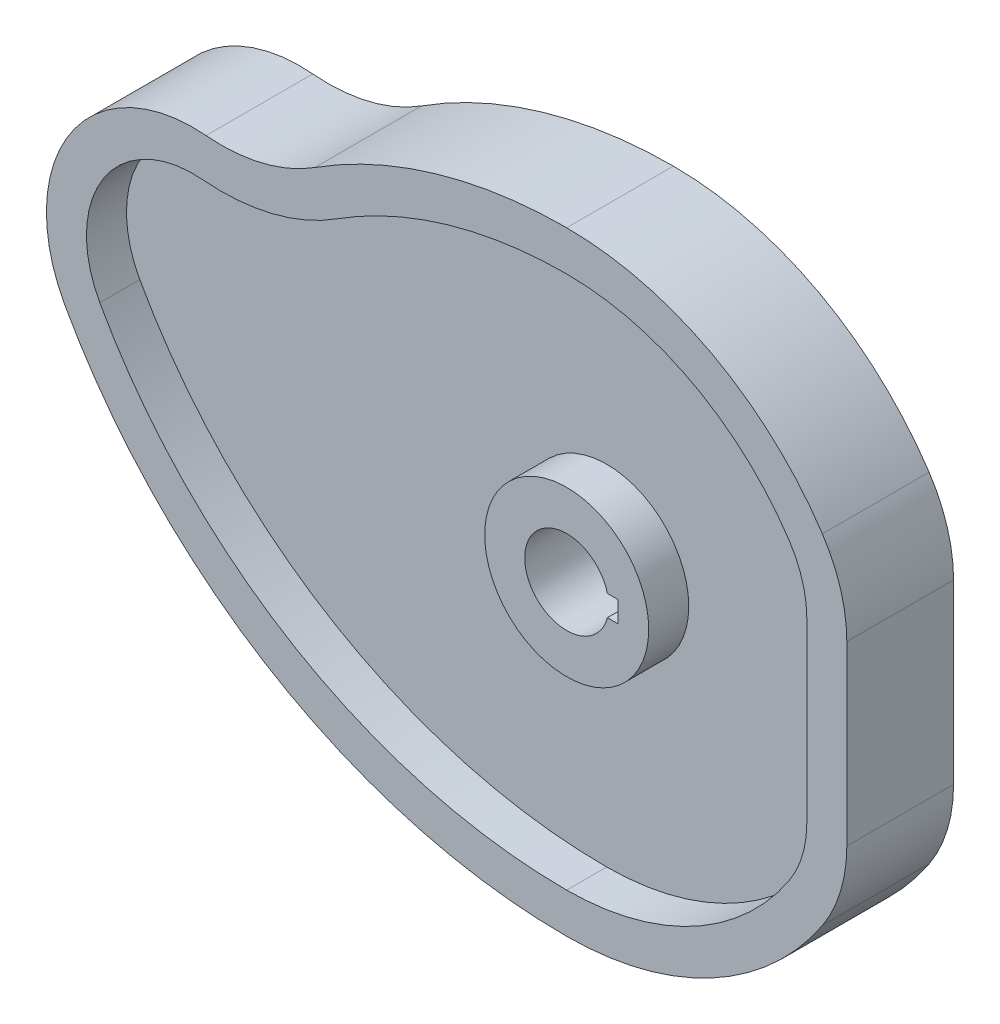
ISO-10303-21;
HEADER;
FILE_DESCRIPTION(('STEP AP214'),'2;1');
FILE_NAME('part.step','',(''),(''),'','','');
FILE_SCHEMA(('AUTOMOTIVE_DESIGN { 1 0 10303 214 1 1 1 1 }'));
ENDSEC;
DATA;
#1=APPLICATION_CONTEXT('core data for automotive mechanical design processes');
#2=APPLICATION_PROTOCOL_DEFINITION('international standard','automotive_design',2000,#1);
#3=PRODUCT_CONTEXT('',#1,'mechanical');
#4=PRODUCT('Part','Part','',(#3));
#5=PRODUCT_RELATED_PRODUCT_CATEGORY('part','',(#4));
#6=PRODUCT_DEFINITION_FORMATION('','',#4);
#7=PRODUCT_DEFINITION_CONTEXT('part definition',#1,'design');
#8=PRODUCT_DEFINITION('design','',#6,#7);
#9=PRODUCT_DEFINITION_SHAPE('','',#8);
#10=(LENGTH_UNIT() NAMED_UNIT(*) SI_UNIT(.MILLI.,.METRE.));
#11=(NAMED_UNIT(*) PLANE_ANGLE_UNIT() SI_UNIT($,.RADIAN.));
#12=(NAMED_UNIT(*) SI_UNIT($,.STERADIAN.) SOLID_ANGLE_UNIT());
#13=UNCERTAINTY_MEASURE_WITH_UNIT(LENGTH_MEASURE(1.E-05),#10,'distance_accuracy_value','');
#14=(GEOMETRIC_REPRESENTATION_CONTEXT(3) GLOBAL_UNCERTAINTY_ASSIGNED_CONTEXT((#13)) GLOBAL_UNIT_ASSIGNED_CONTEXT((#10,
#11,#12)) REPRESENTATION_CONTEXT('',''));
#15=CARTESIAN_POINT('',(0.,0.,0.));
#16=DIRECTION('',(0.,0.,1.));
#17=DIRECTION('',(1.,0.,0.));
#18=AXIS2_PLACEMENT_3D('',#15,#16,#17);
#19=CARTESIAN_POINT('',(0.,0.,25.4));
#20=DIRECTION('',(0.,0.,-1.));
#21=DIRECTION('',(-1.,0.,0.));
#22=AXIS2_PLACEMENT_3D('',#19,#20,#21);
#23=CYLINDRICAL_SURFACE('',#22,127.);
#24=DIRECTION('',(0.,0.,-1.));
#25=VECTOR('',#24,1.);
#26=CARTESIAN_POINT('',(0.,-127.,25.4));
#27=LINE('',#26,#25);
#28=CARTESIAN_POINT('',(0.,-127.,-6.35));
#29=VERTEX_POINT('',#28);
#30=CARTESIAN_POINT('',(0.,-127.,-25.4));
#31=VERTEX_POINT('',#30);
#32=EDGE_CURVE('E517',#29,#31,#27,.T.);
#33=ORIENTED_EDGE('',*,*,#32,.F.);
#34=CARTESIAN_POINT('',(0.,0.,-6.35));
#35=DIRECTION('',(0.,0.,1.));
#36=DIRECTION('',(1.,0.,0.));
#37=AXIS2_PLACEMENT_3D('',#34,#35,#36);
#38=CIRCLE('',#37,127.);
#39=CARTESIAN_POINT('',(105.832287787377,-70.2034675902108,-6.35));
#40=VERTEX_POINT('',#39);
#41=EDGE_CURVE('E354',#29,#40,#38,.T.);
#42=ORIENTED_EDGE('',*,*,#41,.T.);
#43=DIRECTION('',(0.,0.,-1.));
#44=VECTOR('',#43,1.);
#45=CARTESIAN_POINT('',(105.832287787377,-70.2034675902108,25.4));
#46=LINE('',#45,#44);
#47=CARTESIAN_POINT('',(105.832287787377,-70.2034675902108,-25.4));
#48=VERTEX_POINT('',#47);
#49=EDGE_CURVE('E420',#40,#48,#46,.T.);
#50=ORIENTED_EDGE('',*,*,#49,.T.);
#51=CARTESIAN_POINT('',(0.,0.,-25.4));
#52=DIRECTION('',(0.,0.,1.));
#53=DIRECTION('',(1.,0.,0.));
#54=AXIS2_PLACEMENT_3D('',#51,#52,#53);
#55=CIRCLE('',#54,127.);
#56=EDGE_CURVE('E352',#31,#48,#55,.T.);
#57=ORIENTED_EDGE('',*,*,#56,.F.);
#58=EDGE_LOOP('',(#33,#42,#50,#57));
#59=FACE_BOUND('',#58,.T.);
#60=ADVANCED_FACE('F70',(#59),#23,.F.);
#61=CARTESIAN_POINT('',(0.,126.996455690165,25.4));
#62=DIRECTION('',(0.,0.,-1.));
#63=DIRECTION('',(-1.,0.,0.));
#64=AXIS2_PLACEMENT_3D('',#61,#62,#63);
#65=CYLINDRICAL_SURFACE('',#64,253.996455690165);
#66=CARTESIAN_POINT('',(0.,126.996455690165,-6.35));
#67=DIRECTION('',(0.,0.,1.));
#68=DIRECTION('',(1.,0.,0.));
#69=AXIS2_PLACEMENT_3D('',#66,#67,#68);
#70=CIRCLE('',#69,253.996455690165);
#71=CARTESIAN_POINT('',(-222.2507753313,4.03795713149713,-6.35));
#72=VERTEX_POINT('',#71);
#73=EDGE_CURVE('E87',#29,#72,#70,.F.);
#74=ORIENTED_EDGE('',*,*,#73,.F.);
#75=ORIENTED_EDGE('',*,*,#32,.T.);
#76=CARTESIAN_POINT('',(0.,126.996455690165,-25.4));
#77=DIRECTION('',(0.,0.,1.));
#78=DIRECTION('',(1.,0.,0.));
#79=AXIS2_PLACEMENT_3D('',#76,#77,#78);
#80=CIRCLE('',#79,253.996455690165);
#81=CARTESIAN_POINT('',(-222.2507753313,4.03795713149713,-25.4));
#82=VERTEX_POINT('',#81);
#83=EDGE_CURVE('E423',#31,#82,#80,.F.);
#84=ORIENTED_EDGE('',*,*,#83,.T.);
#85=DIRECTION('',(0.,0.,-1.));
#86=VECTOR('',#85,1.);
#87=CARTESIAN_POINT('',(-222.2507753313,4.03795713149713,25.4));
#88=LINE('',#87,#86);
#89=EDGE_CURVE('E514',#72,#82,#88,.T.);
#90=ORIENTED_EDGE('',*,*,#89,.F.);
#91=EDGE_LOOP('',(#74,#75,#84,#90));
#92=FACE_BOUND('',#91,.T.);
#93=ADVANCED_FACE('F524',(#92),#65,.F.);
#94=CARTESIAN_POINT('',(-177.8,28.63,25.4));
#95=DIRECTION('',(0.,0.,-1.));
#96=DIRECTION('',(-1.,0.,0.));
#97=AXIS2_PLACEMENT_3D('',#94,#95,#96);
#98=CYLINDRICAL_SURFACE('',#97,50.8);
#99=DIRECTION('',(0.,0.,-1.));
#100=VECTOR('',#99,1.);
#101=CARTESIAN_POINT('',(-173.343775758532,79.2341704359409,25.4));
#102=LINE('',#101,#100);
#103=CARTESIAN_POINT('',(-173.343775758532,79.2341704359409,-6.35));
#104=VERTEX_POINT('',#103);
#105=CARTESIAN_POINT('',(-173.343775758532,79.2341704359409,-25.4));
#106=VERTEX_POINT('',#105);
#107=EDGE_CURVE('E511',#104,#106,#102,.T.);
#108=ORIENTED_EDGE('',*,*,#107,.F.);
#109=CARTESIAN_POINT('',(-177.8,28.63,-6.35));
#110=DIRECTION('',(0.,0.,1.));
#111=DIRECTION('',(1.,0.,0.));
#112=AXIS2_PLACEMENT_3D('',#109,#110,#111);
#113=CIRCLE('',#112,50.8);
#114=EDGE_CURVE('E95',#104,#72,#113,.T.);
#115=ORIENTED_EDGE('',*,*,#114,.T.);
#116=ORIENTED_EDGE('',*,*,#89,.T.);
#117=CARTESIAN_POINT('',(-177.8,28.63,-25.4));
#118=DIRECTION('',(0.,0.,1.));
#119=DIRECTION('',(1.,0.,0.));
#120=AXIS2_PLACEMENT_3D('',#117,#118,#119);
#121=CIRCLE('',#120,50.8);
#122=EDGE_CURVE('E426',#106,#82,#121,.T.);
#123=ORIENTED_EDGE('',*,*,#122,.F.);
#124=EDGE_LOOP('',(#108,#115,#116,#123));
#125=FACE_BOUND('',#124,.T.);
#126=ADVANCED_FACE('F522',(#125),#98,.F.);
#127=CARTESIAN_POINT('',(-164.431327275596,180.442511307823,25.4));
#128=DIRECTION('',(0.,0.,-1.));
#129=DIRECTION('',(-1.,0.,0.));
#130=AXIS2_PLACEMENT_3D('',#127,#128,#129);
#131=CYLINDRICAL_SURFACE('',#130,101.6);
#132=CARTESIAN_POINT('',(-164.431327275596,180.442511307823,-6.35));
#133=DIRECTION('',(0.,0.,1.));
#134=DIRECTION('',(1.,0.,0.));
#135=AXIS2_PLACEMENT_3D('',#132,#133,#134);
#136=CIRCLE('',#135,101.6);
#137=CARTESIAN_POINT('',(-109.620884850397,94.8950075385484,-6.35));
#138=VERTEX_POINT('',#137);
#139=EDGE_CURVE('E369',#104,#138,#136,.T.);
#140=ORIENTED_EDGE('',*,*,#139,.F.);
#141=ORIENTED_EDGE('',*,*,#107,.T.);
#142=CARTESIAN_POINT('',(-164.431327275596,180.442511307823,-25.4));
#143=DIRECTION('',(0.,0.,1.));
#144=DIRECTION('',(1.,0.,0.));
#145=AXIS2_PLACEMENT_3D('',#142,#143,#144);
#146=CIRCLE('',#145,101.6);
#147=CARTESIAN_POINT('',(-109.620884850397,94.8950075385484,-25.4));
#148=VERTEX_POINT('',#147);
#149=EDGE_CURVE('E429',#106,#148,#146,.T.);
#150=ORIENTED_EDGE('',*,*,#149,.T.);
#151=DIRECTION('',(0.,0.,-1.));
#152=VECTOR('',#151,1.);
#153=CARTESIAN_POINT('',(-109.620884850397,94.8950075385484,25.4));
#154=LINE('',#153,#152);
#155=EDGE_CURVE('E507',#138,#148,#154,.T.);
#156=ORIENTED_EDGE('',*,*,#155,.F.);
#157=EDGE_LOOP('',(#140,#141,#150,#156));
#158=FACE_BOUND('',#157,.T.);
#159=ADVANCED_FACE('F533',(#158),#131,.T.);
#160=CARTESIAN_POINT('',(0.,-76.2,25.4));
#161=DIRECTION('',(0.,0.,-1.));
#162=DIRECTION('',(-1.,0.,0.));
#163=AXIS2_PLACEMENT_3D('',#160,#161,#162);
#164=CYLINDRICAL_SURFACE('',#163,203.2);
#165=DIRECTION('',(0.,0.,-1.));
#166=VECTOR('',#165,1.);
#167=CARTESIAN_POINT('',(0.,127.,25.4));
#168=LINE('',#167,#166);
#169=CARTESIAN_POINT('',(0.,127.,-6.35));
#170=VERTEX_POINT('',#169);
#171=CARTESIAN_POINT('',(0.,127.,-25.4));
#172=VERTEX_POINT('',#171);
#173=EDGE_CURVE('E503',#170,#172,#168,.T.);
#174=ORIENTED_EDGE('',*,*,#173,.F.);
#175=CARTESIAN_POINT('',(0.,-76.2,-6.35));
#176=DIRECTION('',(0.,0.,1.));
#177=DIRECTION('',(1.,0.,0.));
#178=AXIS2_PLACEMENT_3D('',#175,#176,#177);
#179=CIRCLE('',#178,203.2);
#180=EDGE_CURVE('E367',#170,#138,#179,.T.);
#181=ORIENTED_EDGE('',*,*,#180,.T.);
#182=ORIENTED_EDGE('',*,*,#155,.T.);
#183=CARTESIAN_POINT('',(0.,-76.2,-25.4));
#184=DIRECTION('',(0.,0.,1.));
#185=DIRECTION('',(1.,0.,0.));
#186=AXIS2_PLACEMENT_3D('',#183,#184,#185);
#187=CIRCLE('',#186,203.2);
#188=EDGE_CURVE('E432',#172,#148,#187,.T.);
#189=ORIENTED_EDGE('',*,*,#188,.F.);
#190=EDGE_LOOP('',(#174,#181,#182,#189));
#191=FACE_BOUND('',#190,.T.);
#192=ADVANCED_FACE('F559',(#191),#164,.F.);
#193=CARTESIAN_POINT('',(0.,0.,25.4));
#194=DIRECTION('',(0.,0.,-1.));
#195=DIRECTION('',(-1.,0.,0.));
#196=AXIS2_PLACEMENT_3D('',#193,#194,#195);
#197=CYLINDRICAL_SURFACE('',#196,127.);
#198=DIRECTION('',(0.,0.,-1.));
#199=VECTOR('',#198,1.);
#200=CARTESIAN_POINT('',(105.832287787377,70.2034675902108,25.4));
#201=LINE('',#200,#199);
#202=CARTESIAN_POINT('',(105.832287787377,70.2034675902108,-6.35));
#203=VERTEX_POINT('',#202);
#204=CARTESIAN_POINT('',(105.832287787377,70.2034675902108,-25.4));
#205=VERTEX_POINT('',#204);
#206=EDGE_CURVE('E499',#203,#205,#201,.T.);
#207=ORIENTED_EDGE('',*,*,#206,.F.);
#208=CARTESIAN_POINT('',(0.,0.,-6.35));
#209=DIRECTION('',(0.,0.,1.));
#210=DIRECTION('',(1.,0.,0.));
#211=AXIS2_PLACEMENT_3D('',#208,#209,#210);
#212=CIRCLE('',#211,127.);
#213=EDGE_CURVE('E365',#203,#170,#212,.T.);
#214=ORIENTED_EDGE('',*,*,#213,.T.);
#215=ORIENTED_EDGE('',*,*,#173,.T.);
#216=CARTESIAN_POINT('',(0.,0.,-25.4));
#217=DIRECTION('',(0.,0.,1.));
#218=DIRECTION('',(1.,0.,0.));
#219=AXIS2_PLACEMENT_3D('',#216,#217,#218);
#220=CIRCLE('',#219,127.);
#221=EDGE_CURVE('E435',#205,#172,#220,.T.);
#222=ORIENTED_EDGE('',*,*,#221,.F.);
#223=EDGE_LOOP('',(#207,#214,#215,#222));
#224=FACE_BOUND('',#223,.T.);
#225=ADVANCED_FACE('F556',(#224),#197,.F.);
#226=CARTESIAN_POINT('',(63.4962362204731,42.1200000000002,25.4));
#227=DIRECTION('',(0.,0.,-1.));
#228=DIRECTION('',(-1.,0.,0.));
#229=AXIS2_PLACEMENT_3D('',#226,#227,#228);
#230=CYLINDRICAL_SURFACE('',#229,50.8037637795269);
#231=DIRECTION('',(0.,0.,-1.));
#232=VECTOR('',#231,1.);
#233=CARTESIAN_POINT('',(114.3,42.12,25.4));
#234=LINE('',#233,#232);
#235=CARTESIAN_POINT('',(114.3,42.12,-6.35));
#236=VERTEX_POINT('',#235);
#237=CARTESIAN_POINT('',(114.3,42.12,-25.4));
#238=VERTEX_POINT('',#237);
#239=EDGE_CURVE('E495',#236,#238,#234,.T.);
#240=ORIENTED_EDGE('',*,*,#239,.F.);
#241=CARTESIAN_POINT('',(63.4962362204731,42.1200000000002,-6.35));
#242=DIRECTION('',(0.,0.,1.));
#243=DIRECTION('',(1.,0.,0.));
#244=AXIS2_PLACEMENT_3D('',#241,#242,#243);
#245=CIRCLE('',#244,50.8037637795269);
#246=EDGE_CURVE('E363',#236,#203,#245,.T.);
#247=ORIENTED_EDGE('',*,*,#246,.T.);
#248=ORIENTED_EDGE('',*,*,#206,.T.);
#249=CARTESIAN_POINT('',(63.4962362204731,42.1200000000002,-25.4));
#250=DIRECTION('',(0.,0.,1.));
#251=DIRECTION('',(1.,0.,0.));
#252=AXIS2_PLACEMENT_3D('',#249,#250,#251);
#253=CIRCLE('',#252,50.8037637795269);
#254=EDGE_CURVE('E438',#238,#205,#253,.T.);
#255=ORIENTED_EDGE('',*,*,#254,.F.);
#256=EDGE_LOOP('',(#240,#247,#248,#255));
#257=FACE_BOUND('',#256,.T.);
#258=ADVANCED_FACE('F551',(#257),#230,.F.);
#259=CARTESIAN_POINT('',(114.3,0.,25.4));
#260=DIRECTION('',(1.,0.,0.));
#261=DIRECTION('',(0.,0.,-1.));
#262=AXIS2_PLACEMENT_3D('',#259,#260,#261);
#263=PLANE('',#262);
#264=DIRECTION('',(0.,-1.,0.));
#265=VECTOR('',#264,1.);
#266=CARTESIAN_POINT('',(114.3,0.,-6.35));
#267=LINE('',#266,#265);
#268=CARTESIAN_POINT('',(114.3,-42.12,-6.35));
#269=VERTEX_POINT('',#268);
#270=EDGE_CURVE('E360',#236,#269,#267,.T.);
#271=ORIENTED_EDGE('',*,*,#270,.F.);
#272=ORIENTED_EDGE('',*,*,#239,.T.);
#273=DIRECTION('',(0.,-1.,0.));
#274=VECTOR('',#273,1.);
#275=CARTESIAN_POINT('',(114.3,0.,-25.4));
#276=LINE('',#275,#274);
#277=CARTESIAN_POINT('',(114.3,-42.12,-25.4));
#278=VERTEX_POINT('',#277);
#279=EDGE_CURVE('E441',#238,#278,#276,.T.);
#280=ORIENTED_EDGE('',*,*,#279,.T.);
#281=DIRECTION('',(0.,0.,-1.));
#282=VECTOR('',#281,1.);
#283=CARTESIAN_POINT('',(114.3,-42.12,25.4));
#284=LINE('',#283,#282);
#285=EDGE_CURVE('E491',#269,#278,#284,.T.);
#286=ORIENTED_EDGE('',*,*,#285,.F.);
#287=EDGE_LOOP('',(#271,#272,#280,#286));
#288=FACE_BOUND('',#287,.T.);
#289=ADVANCED_FACE('F547',(#288),#263,.F.);
#290=CARTESIAN_POINT('',(63.4962362204729,-42.1200000000002,25.4));
#291=DIRECTION('',(0.,0.,-1.));
#292=DIRECTION('',(-1.,0.,0.));
#293=AXIS2_PLACEMENT_3D('',#290,#291,#292);
#294=CYLINDRICAL_SURFACE('',#293,50.8037637795269);
#295=CARTESIAN_POINT('',(63.4962362204729,-42.1200000000002,-6.35));
#296=DIRECTION('',(0.,0.,1.));
#297=DIRECTION('',(1.,0.,0.));
#298=AXIS2_PLACEMENT_3D('',#295,#296,#297);
#299=CIRCLE('',#298,50.8037637795269);
#300=EDGE_CURVE('E357',#269,#40,#299,.F.);
#301=ORIENTED_EDGE('',*,*,#300,.F.);
#302=ORIENTED_EDGE('',*,*,#285,.T.);
#303=CARTESIAN_POINT('',(63.4962362204729,-42.1200000000002,-25.4));
#304=DIRECTION('',(0.,0.,1.));
#305=DIRECTION('',(1.,0.,0.));
#306=AXIS2_PLACEMENT_3D('',#303,#304,#305);
#307=CIRCLE('',#306,50.8037637795269);
#308=EDGE_CURVE('E444',#278,#48,#307,.F.);
#309=ORIENTED_EDGE('',*,*,#308,.T.);
#310=ORIENTED_EDGE('',*,*,#49,.F.);
#311=EDGE_LOOP('',(#301,#302,#309,#310));
#312=FACE_BOUND('',#311,.T.);
#313=ADVANCED_FACE('F544',(#312),#294,.F.);
#314=CARTESIAN_POINT('',(63.4962362204731,42.1200000000002,25.4));
#315=DIRECTION('',(0.,0.,-1.));
#316=DIRECTION('',(-1.,0.,0.));
#317=AXIS2_PLACEMENT_3D('',#314,#315,#316);
#318=CYLINDRICAL_SURFACE('',#317,69.8537637795269);
#319=CARTESIAN_POINT('',(63.4962362204731,42.1200000000002,-25.4));
#320=DIRECTION('',(0.,0.,1.));
#321=DIRECTION('',(1.,0.,0.));
#322=AXIS2_PLACEMENT_3D('',#319,#320,#321);
#323=CIRCLE('',#322,69.8537637795269);
#324=CARTESIAN_POINT('',(133.35,42.12,-25.4));
#325=VERTEX_POINT('',#324);
#326=CARTESIAN_POINT('',(121.707130955484,80.7339877287424,-25.4));
#327=VERTEX_POINT('',#326);
#328=EDGE_CURVE('E447',#325,#327,#323,.T.);
#329=ORIENTED_EDGE('',*,*,#328,.T.);
#330=DIRECTION('',(0.,0.,-1.));
#331=VECTOR('',#330,1.);
#332=CARTESIAN_POINT('',(121.707130955484,80.7339877287424,25.4));
#333=LINE('',#332,#331);
#334=CARTESIAN_POINT('',(121.707130955484,80.7339877287424,25.4));
#335=VERTEX_POINT('',#334);
#336=EDGE_CURVE('E12',#335,#327,#333,.T.);
#337=ORIENTED_EDGE('',*,*,#336,.F.);
#338=CARTESIAN_POINT('',(63.4962362204731,42.1200000000002,25.4));
#339=DIRECTION('',(0.,0.,1.));
#340=DIRECTION('',(1.,0.,0.));
#341=AXIS2_PLACEMENT_3D('',#338,#339,#340);
#342=CIRCLE('',#341,69.8537637795269);
#343=CARTESIAN_POINT('',(133.35,42.12,25.4));
#344=VERTEX_POINT('',#343);
#345=EDGE_CURVE('E397',#344,#335,#342,.T.);
#346=ORIENTED_EDGE('',*,*,#345,.F.);
#347=DIRECTION('',(0.,0.,-1.));
#348=VECTOR('',#347,1.);
#349=CARTESIAN_POINT('',(133.35,42.12,25.4));
#350=LINE('',#349,#348);
#351=EDGE_CURVE('E472',#344,#325,#350,.T.);
#352=ORIENTED_EDGE('',*,*,#351,.T.);
#353=EDGE_LOOP('',(#329,#337,#346,#352));
#354=FACE_BOUND('',#353,.T.);
#355=ADVANCED_FACE('F669',(#354),#318,.T.);
#356=CARTESIAN_POINT('',(0.,0.,25.4));
#357=DIRECTION('',(0.,0.,-1.));
#358=DIRECTION('',(-1.,0.,0.));
#359=AXIS2_PLACEMENT_3D('',#356,#357,#358);
#360=CYLINDRICAL_SURFACE('',#359,146.05);
#361=CARTESIAN_POINT('',(0.,0.,-25.4));
#362=DIRECTION('',(0.,0.,1.));
#363=DIRECTION('',(1.,0.,0.));
#364=AXIS2_PLACEMENT_3D('',#361,#362,#363);
#365=CIRCLE('',#364,146.05);
#366=CARTESIAN_POINT('',(0.,146.05,-25.4));
#367=VERTEX_POINT('',#366);
#368=EDGE_CURVE('E450',#327,#367,#365,.T.);
#369=ORIENTED_EDGE('',*,*,#368,.T.);
#370=DIRECTION('',(0.,0.,-1.));
#371=VECTOR('',#370,1.);
#372=CARTESIAN_POINT('',(0.,146.05,25.4));
#373=LINE('',#372,#371);
#374=CARTESIAN_POINT('',(0.,146.05,25.4));
#375=VERTEX_POINT('',#374);
#376=EDGE_CURVE('E79',#375,#367,#373,.T.);
#377=ORIENTED_EDGE('',*,*,#376,.F.);
#378=CARTESIAN_POINT('',(0.,0.,25.4));
#379=DIRECTION('',(0.,0.,1.));
#380=DIRECTION('',(1.,0.,0.));
#381=AXIS2_PLACEMENT_3D('',#378,#379,#380);
#382=CIRCLE('',#381,146.05);
#383=EDGE_CURVE('E400',#335,#375,#382,.T.);
#384=ORIENTED_EDGE('',*,*,#383,.F.);
#385=ORIENTED_EDGE('',*,*,#336,.T.);
#386=EDGE_LOOP('',(#369,#377,#384,#385));
#387=FACE_BOUND('',#386,.T.);
#388=ADVANCED_FACE('F878',(#387),#360,.T.);
#389=CARTESIAN_POINT('',(0.,-76.2,25.4));
#390=DIRECTION('',(0.,0.,-1.));
#391=DIRECTION('',(-1.,0.,0.));
#392=AXIS2_PLACEMENT_3D('',#389,#390,#391);
#393=CYLINDRICAL_SURFACE('',#392,222.25);
#394=CARTESIAN_POINT('',(0.,-76.2,-25.4));
#395=DIRECTION('',(0.,0.,1.));
#396=DIRECTION('',(1.,0.,0.));
#397=AXIS2_PLACEMENT_3D('',#394,#395,#396);
#398=CIRCLE('',#397,222.25);
#399=CARTESIAN_POINT('',(-119.897842805122,110.935164495287,-25.4));
#400=VERTEX_POINT('',#399);
#401=EDGE_CURVE('E452',#367,#400,#398,.T.);
#402=ORIENTED_EDGE('',*,*,#401,.T.);
#403=DIRECTION('',(0.,0.,-1.));
#404=VECTOR('',#403,1.);
#405=CARTESIAN_POINT('',(-119.897842805122,110.935164495287,25.4));
#406=LINE('',#405,#404);
#407=CARTESIAN_POINT('',(-119.897842805122,110.935164495287,25.4));
#408=VERTEX_POINT('',#407);
#409=EDGE_CURVE('E484',#408,#400,#406,.T.);
#410=ORIENTED_EDGE('',*,*,#409,.F.);
#411=CARTESIAN_POINT('',(0.,-76.2,25.4));
#412=DIRECTION('',(0.,0.,1.));
#413=DIRECTION('',(1.,0.,0.));
#414=AXIS2_PLACEMENT_3D('',#411,#412,#413);
#415=CIRCLE('',#414,222.25);
#416=EDGE_CURVE('E402',#375,#408,#415,.T.);
#417=ORIENTED_EDGE('',*,*,#416,.F.);
#418=ORIENTED_EDGE('',*,*,#376,.T.);
#419=EDGE_LOOP('',(#402,#410,#417,#418));
#420=FACE_BOUND('',#419,.T.);
#421=ADVANCED_FACE('F874',(#420),#393,.T.);
#422=CARTESIAN_POINT('',(-164.431327275596,180.442511307823,25.4));
#423=DIRECTION('',(0.,0.,-1.));
#424=DIRECTION('',(-1.,0.,0.));
#425=AXIS2_PLACEMENT_3D('',#422,#423,#424);
#426=CYLINDRICAL_SURFACE('',#425,82.5499999999999);
#427=CARTESIAN_POINT('',(-164.431327275596,180.442511307823,-25.4));
#428=DIRECTION('',(0.,0.,1.));
#429=DIRECTION('',(1.,0.,0.));
#430=AXIS2_PLACEMENT_3D('',#427,#428,#429);
#431=CIRCLE('',#430,82.5499999999999);
#432=CARTESIAN_POINT('',(-171.672691667981,98.2107343494187,-25.4));
#433=VERTEX_POINT('',#432);
#434=EDGE_CURVE('E455',#433,#400,#431,.T.);
#435=ORIENTED_EDGE('',*,*,#434,.F.);
#436=DIRECTION('',(0.,0.,-1.));
#437=VECTOR('',#436,1.);
#438=CARTESIAN_POINT('',(-171.672691667981,98.2107343494187,25.4));
#439=LINE('',#438,#437);
#440=CARTESIAN_POINT('',(-171.672691667981,98.2107343494187,25.4));
#441=VERTEX_POINT('',#440);
#442=EDGE_CURVE('E482',#441,#433,#439,.T.);
#443=ORIENTED_EDGE('',*,*,#442,.F.);
#444=CARTESIAN_POINT('',(-164.431327275596,180.442511307823,25.4));
#445=DIRECTION('',(0.,0.,1.));
#446=DIRECTION('',(1.,0.,0.));
#447=AXIS2_PLACEMENT_3D('',#444,#445,#446);
#448=CIRCLE('',#447,82.5499999999999);
#449=EDGE_CURVE('E404',#441,#408,#448,.T.);
#450=ORIENTED_EDGE('',*,*,#449,.T.);
#451=ORIENTED_EDGE('',*,*,#409,.T.);
#452=EDGE_LOOP('',(#435,#443,#450,#451));
#453=FACE_BOUND('',#452,.T.);
#454=ADVANCED_FACE('F870',(#453),#426,.F.);
#455=CARTESIAN_POINT('',(-177.8,28.63,25.4));
#456=DIRECTION('',(0.,0.,-1.));
#457=DIRECTION('',(-1.,0.,0.));
#458=AXIS2_PLACEMENT_3D('',#455,#456,#457);
#459=CYLINDRICAL_SURFACE('',#458,69.85);
#460=CARTESIAN_POINT('',(-177.8,28.63,-25.4));
#461=DIRECTION('',(0.,0.,1.));
#462=DIRECTION('',(1.,0.,0.));
#463=AXIS2_PLACEMENT_3D('',#460,#461,#462);
#464=CIRCLE('',#463,69.85);
#465=CARTESIAN_POINT('',(-238.919816080538,-5.1840589441914,-25.4));
#466=VERTEX_POINT('',#465);
#467=EDGE_CURVE('E458',#433,#466,#464,.T.);
#468=ORIENTED_EDGE('',*,*,#467,.T.);
#469=DIRECTION('',(0.,0.,-1.));
#470=VECTOR('',#469,1.);
#471=CARTESIAN_POINT('',(-238.919816080538,-5.1840589441914,25.4));
#472=LINE('',#471,#470);
#473=CARTESIAN_POINT('',(-238.919816080538,-5.1840589441914,25.4));
#474=VERTEX_POINT('',#473);
#475=EDGE_CURVE('E480',#474,#466,#472,.T.);
#476=ORIENTED_EDGE('',*,*,#475,.F.);
#477=CARTESIAN_POINT('',(-177.8,28.63,25.4));
#478=DIRECTION('',(0.,0.,1.));
#479=DIRECTION('',(1.,0.,0.));
#480=AXIS2_PLACEMENT_3D('',#477,#478,#479);
#481=CIRCLE('',#480,69.85);
#482=EDGE_CURVE('E407',#441,#474,#481,.T.);
#483=ORIENTED_EDGE('',*,*,#482,.F.);
#484=ORIENTED_EDGE('',*,*,#442,.T.);
#485=EDGE_LOOP('',(#468,#476,#483,#484));
#486=FACE_BOUND('',#485,.T.);
#487=ADVANCED_FACE('F866',(#486),#459,.T.);
#488=CARTESIAN_POINT('',(0.,126.996455690165,25.4));
#489=DIRECTION('',(0.,0.,-1.));
#490=DIRECTION('',(-1.,0.,0.));
#491=AXIS2_PLACEMENT_3D('',#488,#489,#490);
#492=CYLINDRICAL_SURFACE('',#491,273.046455690165);
#493=CARTESIAN_POINT('',(0.,126.996455690165,-25.4));
#494=DIRECTION('',(0.,0.,1.));
#495=DIRECTION('',(1.,0.,0.));
#496=AXIS2_PLACEMENT_3D('',#493,#494,#495);
#497=CIRCLE('',#496,273.046455690165);
#498=CARTESIAN_POINT('',(0.,-146.05,-25.4));
#499=VERTEX_POINT('',#498);
#500=EDGE_CURVE('E461',#499,#466,#497,.F.);
#501=ORIENTED_EDGE('',*,*,#500,.F.);
#502=DIRECTION('',(0.,0.,-1.));
#503=VECTOR('',#502,1.);
#504=CARTESIAN_POINT('',(0.,-146.05,25.4));
#505=LINE('',#504,#503);
#506=CARTESIAN_POINT('',(0.,-146.05,25.4));
#507=VERTEX_POINT('',#506);
#508=EDGE_CURVE('E478',#507,#499,#505,.T.);
#509=ORIENTED_EDGE('',*,*,#508,.F.);
#510=CARTESIAN_POINT('',(0.,126.996455690165,25.4));
#511=DIRECTION('',(0.,0.,1.));
#512=DIRECTION('',(1.,0.,0.));
#513=AXIS2_PLACEMENT_3D('',#510,#511,#512);
#514=CIRCLE('',#513,273.046455690165);
#515=EDGE_CURVE('E409',#507,#474,#514,.F.);
#516=ORIENTED_EDGE('',*,*,#515,.T.);
#517=ORIENTED_EDGE('',*,*,#475,.T.);
#518=EDGE_LOOP('',(#501,#509,#516,#517));
#519=FACE_BOUND('',#518,.T.);
#520=ADVANCED_FACE('F862',(#519),#492,.T.);
#521=CARTESIAN_POINT('',(0.,0.,25.4));
#522=DIRECTION('',(0.,0.,-1.));
#523=DIRECTION('',(-1.,0.,0.));
#524=AXIS2_PLACEMENT_3D('',#521,#522,#523);
#525=CYLINDRICAL_SURFACE('',#524,146.05);
#526=CARTESIAN_POINT('',(0.,0.,-25.4));
#527=DIRECTION('',(0.,0.,1.));
#528=DIRECTION('',(1.,0.,0.));
#529=AXIS2_PLACEMENT_3D('',#526,#527,#528);
#530=CIRCLE('',#529,146.05);
#531=CARTESIAN_POINT('',(121.707130955484,-80.7339877287425,-25.4));
#532=VERTEX_POINT('',#531);
#533=EDGE_CURVE('E464',#499,#532,#530,.T.);
#534=ORIENTED_EDGE('',*,*,#533,.T.);
#535=DIRECTION('',(0.,0.,-1.));
#536=VECTOR('',#535,1.);
#537=CARTESIAN_POINT('',(121.707130955484,-80.7339877287425,25.4));
#538=LINE('',#537,#536);
#539=CARTESIAN_POINT('',(121.707130955484,-80.7339877287425,25.4));
#540=VERTEX_POINT('',#539);
#541=EDGE_CURVE('E476',#540,#532,#538,.T.);
#542=ORIENTED_EDGE('',*,*,#541,.F.);
#543=CARTESIAN_POINT('',(0.,0.,25.4));
#544=DIRECTION('',(0.,0.,1.));
#545=DIRECTION('',(1.,0.,0.));
#546=AXIS2_PLACEMENT_3D('',#543,#544,#545);
#547=CIRCLE('',#546,146.05);
#548=EDGE_CURVE('E412',#507,#540,#547,.T.);
#549=ORIENTED_EDGE('',*,*,#548,.F.);
#550=ORIENTED_EDGE('',*,*,#508,.T.);
#551=EDGE_LOOP('',(#534,#542,#549,#550));
#552=FACE_BOUND('',#551,.T.);
#553=ADVANCED_FACE('F587',(#552),#525,.T.);
#554=CARTESIAN_POINT('',(63.4962362204729,-42.1200000000002,25.4));
#555=DIRECTION('',(0.,0.,-1.));
#556=DIRECTION('',(-1.,0.,0.));
#557=AXIS2_PLACEMENT_3D('',#554,#555,#556);
#558=CYLINDRICAL_SURFACE('',#557,69.8537637795269);
#559=CARTESIAN_POINT('',(63.4962362204729,-42.1200000000002,-25.4));
#560=DIRECTION('',(0.,0.,1.));
#561=DIRECTION('',(1.,0.,0.));
#562=AXIS2_PLACEMENT_3D('',#559,#560,#561);
#563=CIRCLE('',#562,69.8537637795269);
#564=CARTESIAN_POINT('',(133.35,-42.1199999999999,-25.4));
#565=VERTEX_POINT('',#564);
#566=EDGE_CURVE('E467',#565,#532,#563,.F.);
#567=ORIENTED_EDGE('',*,*,#566,.F.);
#568=DIRECTION('',(0.,0.,-1.));
#569=VECTOR('',#568,1.);
#570=CARTESIAN_POINT('',(133.35,-42.1199999999999,25.4));
#571=LINE('',#570,#569);
#572=CARTESIAN_POINT('',(133.35,-42.1199999999999,25.4));
#573=VERTEX_POINT('',#572);
#574=EDGE_CURVE('E474',#573,#565,#571,.T.);
#575=ORIENTED_EDGE('',*,*,#574,.F.);
#576=CARTESIAN_POINT('',(63.4962362204729,-42.1200000000002,25.4));
#577=DIRECTION('',(0.,0.,1.));
#578=DIRECTION('',(1.,0.,0.));
#579=AXIS2_PLACEMENT_3D('',#576,#577,#578);
#580=CIRCLE('',#579,69.8537637795269);
#581=EDGE_CURVE('E414',#573,#540,#580,.F.);
#582=ORIENTED_EDGE('',*,*,#581,.T.);
#583=ORIENTED_EDGE('',*,*,#541,.T.);
#584=EDGE_LOOP('',(#567,#575,#582,#583));
#585=FACE_BOUND('',#584,.T.);
#586=ADVANCED_FACE('F579',(#585),#558,.T.);
#587=CARTESIAN_POINT('',(0.,0.,6.35));
#588=DIRECTION('',(0.,0.,1.));
#589=DIRECTION('',(1.,0.,0.));
#590=AXIS2_PLACEMENT_3D('',#587,#588,#589);
#591=CIRCLE('',#590,127.);
#592=CARTESIAN_POINT('',(0.,-127.,6.35));
#593=VERTEX_POINT('',#592);
#594=CARTESIAN_POINT('',(105.832287787377,-70.2034675902108,6.35));
#595=VERTEX_POINT('',#594);
#596=EDGE_CURVE('E330',#593,#595,#591,.T.);
#597=ORIENTED_EDGE('',*,*,#596,.F.);
#598=CARTESIAN_POINT('',(0.,-127.,25.4));
#599=VERTEX_POINT('',#598);
#600=EDGE_CURVE('E74',#599,#593,#27,.T.);
#601=ORIENTED_EDGE('',*,*,#600,.F.);
#602=CARTESIAN_POINT('',(0.,0.,25.4));
#603=DIRECTION('',(0.,0.,1.));
#604=DIRECTION('',(1.,0.,0.));
#605=AXIS2_PLACEMENT_3D('',#602,#603,#604);
#606=CIRCLE('',#605,127.);
#607=CARTESIAN_POINT('',(105.832287787377,-70.2034675902108,25.4));
#608=VERTEX_POINT('',#607);
#609=EDGE_CURVE('E373',#599,#608,#606,.T.);
#610=ORIENTED_EDGE('',*,*,#609,.T.);
#611=EDGE_CURVE('E488',#608,#595,#46,.T.);
#612=ORIENTED_EDGE('',*,*,#611,.T.);
#613=EDGE_LOOP('',(#597,#601,#610,#612));
#614=FACE_BOUND('',#613,.T.);
#615=ADVANCED_FACE('F72',(#614),#23,.F.);
#616=ORIENTED_EDGE('',*,*,#600,.T.);
#617=CARTESIAN_POINT('',(0.,126.996455690165,6.35));
#618=DIRECTION('',(0.,0.,1.));
#619=DIRECTION('',(1.,0.,0.));
#620=AXIS2_PLACEMENT_3D('',#617,#618,#619);
#621=CIRCLE('',#620,253.996455690165);
#622=CARTESIAN_POINT('',(-222.2507753313,4.03795713149713,6.35));
#623=VERTEX_POINT('',#622);
#624=EDGE_CURVE('E327',#593,#623,#621,.F.);
#625=ORIENTED_EDGE('',*,*,#624,.T.);
#626=CARTESIAN_POINT('',(-222.2507753313,4.03795713149713,25.4));
#627=VERTEX_POINT('',#626);
#628=EDGE_CURVE('E515',#627,#623,#88,.T.);
#629=ORIENTED_EDGE('',*,*,#628,.F.);
#630=CARTESIAN_POINT('',(0.,126.996455690165,25.4));
#631=DIRECTION('',(0.,0.,1.));
#632=DIRECTION('',(1.,0.,0.));
#633=AXIS2_PLACEMENT_3D('',#630,#631,#632);
#634=CIRCLE('',#633,253.996455690165);
#635=EDGE_CURVE('E376',#599,#627,#634,.F.);
#636=ORIENTED_EDGE('',*,*,#635,.F.);
#637=EDGE_LOOP('',(#616,#625,#629,#636));
#638=FACE_BOUND('',#637,.T.);
#639=ADVANCED_FACE('F577',(#638),#65,.F.);
#640=CARTESIAN_POINT('',(-177.8,28.63,6.35));
#641=DIRECTION('',(0.,0.,1.));
#642=DIRECTION('',(1.,0.,0.));
#643=AXIS2_PLACEMENT_3D('',#640,#641,#642);
#644=CIRCLE('',#643,50.8);
#645=CARTESIAN_POINT('',(-173.343775758532,79.2341704359409,6.35));
#646=VERTEX_POINT('',#645);
#647=EDGE_CURVE('E347',#646,#623,#644,.T.);
#648=ORIENTED_EDGE('',*,*,#647,.F.);
#649=CARTESIAN_POINT('',(-173.343775758532,79.2341704359409,25.4));
#650=VERTEX_POINT('',#649);
#651=EDGE_CURVE('E512',#650,#646,#102,.T.);
#652=ORIENTED_EDGE('',*,*,#651,.F.);
#653=CARTESIAN_POINT('',(-177.8,28.63,25.4));
#654=DIRECTION('',(0.,0.,1.));
#655=DIRECTION('',(1.,0.,0.));
#656=AXIS2_PLACEMENT_3D('',#653,#654,#655);
#657=CIRCLE('',#656,50.8);
#658=EDGE_CURVE('E379',#650,#627,#657,.T.);
#659=ORIENTED_EDGE('',*,*,#658,.T.);
#660=ORIENTED_EDGE('',*,*,#628,.T.);
#661=EDGE_LOOP('',(#648,#652,#659,#660));
#662=FACE_BOUND('',#661,.T.);
#663=ADVANCED_FACE('F585',(#662),#98,.F.);
#664=ORIENTED_EDGE('',*,*,#651,.T.);
#665=CARTESIAN_POINT('',(-164.431327275596,180.442511307823,6.35));
#666=DIRECTION('',(0.,0.,1.));
#667=DIRECTION('',(1.,0.,0.));
#668=AXIS2_PLACEMENT_3D('',#665,#666,#667);
#669=CIRCLE('',#668,101.6);
#670=CARTESIAN_POINT('',(-109.620884850397,94.8950075385484,6.35));
#671=VERTEX_POINT('',#670);
#672=EDGE_CURVE('E344',#646,#671,#669,.T.);
#673=ORIENTED_EDGE('',*,*,#672,.T.);
#674=CARTESIAN_POINT('',(-109.620884850397,94.8950075385484,25.4));
#675=VERTEX_POINT('',#674);
#676=EDGE_CURVE('E508',#675,#671,#154,.T.);
#677=ORIENTED_EDGE('',*,*,#676,.F.);
#678=CARTESIAN_POINT('',(-164.431327275596,180.442511307823,25.4));
#679=DIRECTION('',(0.,0.,1.));
#680=DIRECTION('',(1.,0.,0.));
#681=AXIS2_PLACEMENT_3D('',#678,#679,#680);
#682=CIRCLE('',#681,101.6);
#683=EDGE_CURVE('E382',#650,#675,#682,.T.);
#684=ORIENTED_EDGE('',*,*,#683,.F.);
#685=EDGE_LOOP('',(#664,#673,#677,#684));
#686=FACE_BOUND('',#685,.T.);
#687=ADVANCED_FACE('F570',(#686),#131,.T.);
#688=CARTESIAN_POINT('',(0.,-76.2,6.35));
#689=DIRECTION('',(0.,0.,1.));
#690=DIRECTION('',(1.,0.,0.));
#691=AXIS2_PLACEMENT_3D('',#688,#689,#690);
#692=CIRCLE('',#691,203.2);
#693=CARTESIAN_POINT('',(0.,127.,6.35));
#694=VERTEX_POINT('',#693);
#695=EDGE_CURVE('E342',#694,#671,#692,.T.);
#696=ORIENTED_EDGE('',*,*,#695,.F.);
#697=CARTESIAN_POINT('',(0.,127.,25.4));
#698=VERTEX_POINT('',#697);
#699=EDGE_CURVE('E504',#698,#694,#168,.T.);
#700=ORIENTED_EDGE('',*,*,#699,.F.);
#701=CARTESIAN_POINT('',(0.,-76.2,25.4));
#702=DIRECTION('',(0.,0.,1.));
#703=DIRECTION('',(1.,0.,0.));
#704=AXIS2_PLACEMENT_3D('',#701,#702,#703);
#705=CIRCLE('',#704,203.2);
#706=EDGE_CURVE('E384',#698,#675,#705,.T.);
#707=ORIENTED_EDGE('',*,*,#706,.T.);
#708=ORIENTED_EDGE('',*,*,#676,.T.);
#709=EDGE_LOOP('',(#696,#700,#707,#708));
#710=FACE_BOUND('',#709,.T.);
#711=ADVANCED_FACE('F562',(#710),#164,.F.);
#712=CARTESIAN_POINT('',(0.,0.,6.35));
#713=DIRECTION('',(0.,0.,1.));
#714=DIRECTION('',(1.,0.,0.));
#715=AXIS2_PLACEMENT_3D('',#712,#713,#714);
#716=CIRCLE('',#715,127.);
#717=CARTESIAN_POINT('',(105.832287787377,70.2034675902108,6.35));
#718=VERTEX_POINT('',#717);
#719=EDGE_CURVE('E340',#718,#694,#716,.T.);
#720=ORIENTED_EDGE('',*,*,#719,.F.);
#721=CARTESIAN_POINT('',(105.832287787377,70.2034675902108,25.4));
#722=VERTEX_POINT('',#721);
#723=EDGE_CURVE('E500',#722,#718,#201,.T.);
#724=ORIENTED_EDGE('',*,*,#723,.F.);
#725=CARTESIAN_POINT('',(0.,0.,25.4));
#726=DIRECTION('',(0.,0.,1.));
#727=DIRECTION('',(1.,0.,0.));
#728=AXIS2_PLACEMENT_3D('',#725,#726,#727);
#729=CIRCLE('',#728,127.);
#730=EDGE_CURVE('E387',#722,#698,#729,.T.);
#731=ORIENTED_EDGE('',*,*,#730,.T.);
#732=ORIENTED_EDGE('',*,*,#699,.T.);
#733=EDGE_LOOP('',(#720,#724,#731,#732));
#734=FACE_BOUND('',#733,.T.);
#735=ADVANCED_FACE('F568',(#734),#197,.F.);
#736=CARTESIAN_POINT('',(63.4962362204731,42.1200000000002,6.35));
#737=DIRECTION('',(0.,0.,1.));
#738=DIRECTION('',(1.,0.,0.));
#739=AXIS2_PLACEMENT_3D('',#736,#737,#738);
#740=CIRCLE('',#739,50.8037637795269);
#741=CARTESIAN_POINT('',(114.3,42.12,6.35));
#742=VERTEX_POINT('',#741);
#743=EDGE_CURVE('E338',#742,#718,#740,.T.);
#744=ORIENTED_EDGE('',*,*,#743,.F.);
#745=CARTESIAN_POINT('',(114.3,42.12,25.4));
#746=VERTEX_POINT('',#745);
#747=EDGE_CURVE('E496',#746,#742,#234,.T.);
#748=ORIENTED_EDGE('',*,*,#747,.F.);
#749=CARTESIAN_POINT('',(63.4962362204731,42.1200000000002,25.4));
#750=DIRECTION('',(0.,0.,1.));
#751=DIRECTION('',(1.,0.,0.));
#752=AXIS2_PLACEMENT_3D('',#749,#750,#751);
#753=CIRCLE('',#752,50.8037637795269);
#754=EDGE_CURVE('E390',#746,#722,#753,.T.);
#755=ORIENTED_EDGE('',*,*,#754,.T.);
#756=ORIENTED_EDGE('',*,*,#723,.T.);
#757=EDGE_LOOP('',(#744,#748,#755,#756));
#758=FACE_BOUND('',#757,.T.);
#759=ADVANCED_FACE('F612',(#758),#230,.F.);
#760=ORIENTED_EDGE('',*,*,#747,.T.);
#761=DIRECTION('',(0.,-1.,0.));
#762=VECTOR('',#761,1.);
#763=CARTESIAN_POINT('',(114.3,0.,6.35));
#764=LINE('',#763,#762);
#765=CARTESIAN_POINT('',(114.3,-42.12,6.35));
#766=VERTEX_POINT('',#765);
#767=EDGE_CURVE('E335',#742,#766,#764,.T.);
#768=ORIENTED_EDGE('',*,*,#767,.T.);
#769=CARTESIAN_POINT('',(114.3,-42.12,25.4));
#770=VERTEX_POINT('',#769);
#771=EDGE_CURVE('E492',#770,#766,#284,.T.);
#772=ORIENTED_EDGE('',*,*,#771,.F.);
#773=DIRECTION('',(0.,-1.,0.));
#774=VECTOR('',#773,1.);
#775=CARTESIAN_POINT('',(114.3,0.,25.4));
#776=LINE('',#775,#774);
#777=EDGE_CURVE('E393',#746,#770,#776,.T.);
#778=ORIENTED_EDGE('',*,*,#777,.F.);
#779=EDGE_LOOP('',(#760,#768,#772,#778));
#780=FACE_BOUND('',#779,.T.);
#781=ADVANCED_FACE('F610',(#780),#263,.F.);
#782=ORIENTED_EDGE('',*,*,#771,.T.);
#783=CARTESIAN_POINT('',(63.4962362204729,-42.1200000000002,6.35));
#784=DIRECTION('',(0.,0.,1.));
#785=DIRECTION('',(1.,0.,0.));
#786=AXIS2_PLACEMENT_3D('',#783,#784,#785);
#787=CIRCLE('',#786,50.8037637795269);
#788=EDGE_CURVE('E332',#766,#595,#787,.F.);
#789=ORIENTED_EDGE('',*,*,#788,.T.);
#790=ORIENTED_EDGE('',*,*,#611,.F.);
#791=CARTESIAN_POINT('',(63.4962362204729,-42.1200000000002,25.4));
#792=DIRECTION('',(0.,0.,1.));
#793=DIRECTION('',(1.,0.,0.));
#794=AXIS2_PLACEMENT_3D('',#791,#792,#793);
#795=CIRCLE('',#794,50.8037637795269);
#796=EDGE_CURVE('E395',#770,#608,#795,.F.);
#797=ORIENTED_EDGE('',*,*,#796,.F.);
#798=EDGE_LOOP('',(#782,#789,#790,#797));
#799=FACE_BOUND('',#798,.T.);
#800=ADVANCED_FACE('F605',(#799),#294,.F.);
#801=CARTESIAN_POINT('',(133.35,-2.19682217969143E-13,25.4));
#802=DIRECTION('',(1.,0.,0.));
#803=DIRECTION('',(0.,1.,0.));
#804=AXIS2_PLACEMENT_3D('',#801,#802,#803);
#805=PLANE('',#804);
#806=DIRECTION('',(0.,-1.,0.));
#807=VECTOR('',#806,1.);
#808=CARTESIAN_POINT('',(133.35,-2.19682217969143E-13,-25.4));
#809=LINE('',#808,#807);
#810=EDGE_CURVE('E377',#325,#565,#809,.T.);
#811=ORIENTED_EDGE('',*,*,#810,.F.);
#812=ORIENTED_EDGE('',*,*,#351,.F.);
#813=DIRECTION('',(0.,-1.,0.));
#814=VECTOR('',#813,1.);
#815=CARTESIAN_POINT('',(133.35,-2.19682217969143E-13,25.4));
#816=LINE('',#815,#814);
#817=EDGE_CURVE('E417',#344,#573,#816,.T.);
#818=ORIENTED_EDGE('',*,*,#817,.T.);
#819=ORIENTED_EDGE('',*,*,#574,.T.);
#820=EDGE_LOOP('',(#811,#812,#818,#819));
#821=FACE_BOUND('',#820,.T.);
#822=ADVANCED_FACE('F737',(#821),#805,.T.);
#823=CARTESIAN_POINT('',(0.,0.,25.4));
#824=DIRECTION('',(0.,0.,1.));
#825=DIRECTION('',(1.,0.,0.));
#826=AXIS2_PLACEMENT_3D('',#823,#824,#825);
#827=PLANE('',#826);
#828=ORIENTED_EDGE('',*,*,#609,.F.);
#829=ORIENTED_EDGE('',*,*,#635,.T.);
#830=ORIENTED_EDGE('',*,*,#658,.F.);
#831=ORIENTED_EDGE('',*,*,#683,.T.);
#832=ORIENTED_EDGE('',*,*,#706,.F.);
#833=ORIENTED_EDGE('',*,*,#730,.F.);
#834=ORIENTED_EDGE('',*,*,#754,.F.);
#835=ORIENTED_EDGE('',*,*,#777,.T.);
#836=ORIENTED_EDGE('',*,*,#796,.T.);
#837=EDGE_LOOP('',(#828,#829,#830,#831,#832,#833,#834,#835,#836));
#838=FACE_BOUND('',#837,.T.);
#839=ORIENTED_EDGE('',*,*,#345,.T.);
#840=ORIENTED_EDGE('',*,*,#383,.T.);
#841=ORIENTED_EDGE('',*,*,#416,.T.);
#842=ORIENTED_EDGE('',*,*,#449,.F.);
#843=ORIENTED_EDGE('',*,*,#482,.T.);
#844=ORIENTED_EDGE('',*,*,#515,.F.);
#845=ORIENTED_EDGE('',*,*,#548,.T.);
#846=ORIENTED_EDGE('',*,*,#581,.F.);
#847=ORIENTED_EDGE('',*,*,#817,.F.);
#848=EDGE_LOOP('',(#839,#840,#841,#842,#843,#844,#845,#846,#847));
#849=FACE_BOUND('',#848,.T.);
#850=ADVANCED_FACE('F598',(#838,#849),#827,.T.);
#851=CARTESIAN_POINT('',(0.,0.,-25.4));
#852=DIRECTION('',(0.,0.,1.));
#853=DIRECTION('',(1.,0.,0.));
#854=AXIS2_PLACEMENT_3D('',#851,#852,#853);
#855=PLANE('',#854);
#856=ORIENTED_EDGE('',*,*,#56,.T.);
#857=ORIENTED_EDGE('',*,*,#308,.F.);
#858=ORIENTED_EDGE('',*,*,#279,.F.);
#859=ORIENTED_EDGE('',*,*,#254,.T.);
#860=ORIENTED_EDGE('',*,*,#221,.T.);
#861=ORIENTED_EDGE('',*,*,#188,.T.);
#862=ORIENTED_EDGE('',*,*,#149,.F.);
#863=ORIENTED_EDGE('',*,*,#122,.T.);
#864=ORIENTED_EDGE('',*,*,#83,.F.);
#865=EDGE_LOOP('',(#856,#857,#858,#859,#860,#861,#862,#863,#864));
#866=FACE_BOUND('',#865,.T.);
#867=ORIENTED_EDGE('',*,*,#328,.F.);
#868=ORIENTED_EDGE('',*,*,#810,.T.);
#869=ORIENTED_EDGE('',*,*,#566,.T.);
#870=ORIENTED_EDGE('',*,*,#533,.F.);
#871=ORIENTED_EDGE('',*,*,#500,.T.);
#872=ORIENTED_EDGE('',*,*,#467,.F.);
#873=ORIENTED_EDGE('',*,*,#434,.T.);
#874=ORIENTED_EDGE('',*,*,#401,.F.);
#875=ORIENTED_EDGE('',*,*,#368,.F.);
#876=EDGE_LOOP('',(#867,#868,#869,#870,#871,#872,#873,#874,#875));
#877=FACE_BOUND('',#876,.T.);
#878=ADVANCED_FACE('F528',(#866,#877),#855,.F.);
#879=CARTESIAN_POINT('',(0.,0.,6.35));
#880=DIRECTION('',(0.,0.,1.));
#881=DIRECTION('',(1.,0.,0.));
#882=AXIS2_PLACEMENT_3D('',#879,#880,#881);
#883=PLANE('',#882);
#884=ORIENTED_EDGE('',*,*,#624,.F.);
#885=ORIENTED_EDGE('',*,*,#596,.T.);
#886=ORIENTED_EDGE('',*,*,#788,.F.);
#887=ORIENTED_EDGE('',*,*,#767,.F.);
#888=ORIENTED_EDGE('',*,*,#743,.T.);
#889=ORIENTED_EDGE('',*,*,#719,.T.);
#890=ORIENTED_EDGE('',*,*,#695,.T.);
#891=ORIENTED_EDGE('',*,*,#672,.F.);
#892=ORIENTED_EDGE('',*,*,#647,.T.);
#893=EDGE_LOOP('',(#884,#885,#886,#887,#888,#889,#890,#891,#892));
#894=FACE_BOUND('',#893,.T.);
#895=CARTESIAN_POINT('',(0.,0.,6.35));
#896=DIRECTION('',(0.,0.,1.));
#897=DIRECTION('',(1.,0.,0.));
#898=AXIS2_PLACEMENT_3D('',#895,#896,#897);
#899=CIRCLE('',#898,39.05);
#900=CARTESIAN_POINT('',(39.05,0.,6.35));
#901=VERTEX_POINT('',#900);
#902=EDGE_CURVE('E349',#901,#901,#899,.T.);
#903=ORIENTED_EDGE('',*,*,#902,.F.);
#904=EDGE_LOOP('',(#903));
#905=FACE_BOUND('',#904,.T.);
#906=ADVANCED_FACE('F606',(#894,#905),#883,.T.);
#907=CARTESIAN_POINT('',(0.,0.,-6.35));
#908=DIRECTION('',(0.,0.,1.));
#909=DIRECTION('',(1.,0.,0.));
#910=AXIS2_PLACEMENT_3D('',#907,#908,#909);
#911=PLANE('',#910);
#912=ORIENTED_EDGE('',*,*,#73,.T.);
#913=ORIENTED_EDGE('',*,*,#114,.F.);
#914=ORIENTED_EDGE('',*,*,#139,.T.);
#915=ORIENTED_EDGE('',*,*,#180,.F.);
#916=ORIENTED_EDGE('',*,*,#213,.F.);
#917=ORIENTED_EDGE('',*,*,#246,.F.);
#918=ORIENTED_EDGE('',*,*,#270,.T.);
#919=ORIENTED_EDGE('',*,*,#300,.T.);
#920=ORIENTED_EDGE('',*,*,#41,.F.);
#921=EDGE_LOOP('',(#912,#913,#914,#915,#916,#917,#918,#919,#920));
#922=FACE_BOUND('',#921,.T.);
#923=CARTESIAN_POINT('',(0.,0.,-6.35));
#924=DIRECTION('',(0.,0.,1.));
#925=DIRECTION('',(1.,0.,0.));
#926=AXIS2_PLACEMENT_3D('',#923,#924,#925);
#927=CIRCLE('',#926,39.05);
#928=CARTESIAN_POINT('',(39.05,0.,-6.35));
#929=VERTEX_POINT('',#928);
#930=EDGE_CURVE('E286',#929,#929,#927,.F.);
#931=ORIENTED_EDGE('',*,*,#930,.F.);
#932=EDGE_LOOP('',(#931));
#933=FACE_BOUND('',#932,.T.);
#934=ADVANCED_FACE('F535',(#922,#933),#911,.F.);
#935=CARTESIAN_POINT('',(0.,0.,25.4));
#936=DIRECTION('',(0.,0.,-1.));
#937=DIRECTION('',(-1.,0.,0.));
#938=AXIS2_PLACEMENT_3D('',#935,#936,#937);
#939=CYLINDRICAL_SURFACE('',#938,39.05);
#940=CARTESIAN_POINT('',(0.,0.,-25.4));
#941=DIRECTION('',(0.,0.,1.));
#942=DIRECTION('',(1.,0.,0.));
#943=AXIS2_PLACEMENT_3D('',#940,#941,#942);
#944=CIRCLE('',#943,39.05);
#945=CARTESIAN_POINT('',(39.05,0.,-25.4));
#946=VERTEX_POINT('',#945);
#947=EDGE_CURVE('E301',#946,#946,#944,.T.);
#948=ORIENTED_EDGE('',*,*,#947,.T.);
#949=EDGE_LOOP('',(#948));
#950=FACE_BOUND('',#949,.T.);
#951=ORIENTED_EDGE('',*,*,#930,.T.);
#952=EDGE_LOOP('',(#951));
#953=FACE_BOUND('',#952,.T.);
#954=ADVANCED_FACE('F759',(#950,#953),#939,.T.);
#955=CARTESIAN_POINT('',(0.,0.,25.4));
#956=DIRECTION('',(0.,0.,-1.));
#957=DIRECTION('',(-1.,0.,0.));
#958=AXIS2_PLACEMENT_3D('',#955,#956,#957);
#959=CYLINDRICAL_SURFACE('',#958,20.);
#960=CARTESIAN_POINT('',(0.,0.,-25.4));
#961=DIRECTION('',(0.,0.,1.));
#962=DIRECTION('',(1.,0.,0.));
#963=AXIS2_PLACEMENT_3D('',#960,#961,#962);
#964=CIRCLE('',#963,20.);
#965=CARTESIAN_POINT('',(19.3649167310371,5.,-25.4));
#966=VERTEX_POINT('',#965);
#967=CARTESIAN_POINT('',(19.3649167310371,-5.,-25.4));
#968=VERTEX_POINT('',#967);
#969=EDGE_CURVE('E283',#966,#968,#964,.T.);
#970=ORIENTED_EDGE('',*,*,#969,.F.);
#971=DIRECTION('',(0.,0.,-1.));
#972=VECTOR('',#971,1.);
#973=CARTESIAN_POINT('',(19.3649167310371,5.,25.4));
#974=LINE('',#973,#972);
#975=CARTESIAN_POINT('',(19.3649167310371,5.,25.4));
#976=VERTEX_POINT('',#975);
#977=EDGE_CURVE('E276',#976,#966,#974,.T.);
#978=ORIENTED_EDGE('',*,*,#977,.F.);
#979=CARTESIAN_POINT('',(0.,0.,25.4));
#980=DIRECTION('',(0.,0.,1.));
#981=DIRECTION('',(1.,0.,0.));
#982=AXIS2_PLACEMENT_3D('',#979,#980,#981);
#983=CIRCLE('',#982,20.);
#984=CARTESIAN_POINT('',(19.3649167310371,-5.,25.4));
#985=VERTEX_POINT('',#984);
#986=EDGE_CURVE('E280',#976,#985,#983,.T.);
#987=ORIENTED_EDGE('',*,*,#986,.T.);
#988=DIRECTION('',(0.,0.,-1.));
#989=VECTOR('',#988,1.);
#990=CARTESIAN_POINT('',(19.3649167310371,-5.,25.4));
#991=LINE('',#990,#989);
#992=EDGE_CURVE('E312',#985,#968,#991,.T.);
#993=ORIENTED_EDGE('',*,*,#992,.T.);
#994=EDGE_LOOP('',(#970,#978,#987,#993));
#995=FACE_BOUND('',#994,.T.);
#996=ADVANCED_FACE('F278',(#995),#959,.F.);
#997=CARTESIAN_POINT('',(0.,5.,25.4));
#998=DIRECTION('',(0.,1.,0.));
#999=DIRECTION('',(-1.,0.,0.));
#1000=AXIS2_PLACEMENT_3D('',#997,#998,#999);
#1001=PLANE('',#1000);
#1002=DIRECTION('',(1.,0.,0.));
#1003=VECTOR('',#1002,1.);
#1004=CARTESIAN_POINT('',(0.,5.,-25.4));
#1005=LINE('',#1004,#1003);
#1006=CARTESIAN_POINT('',(24.3649167310371,5.,-25.4));
#1007=VERTEX_POINT('',#1006);
#1008=EDGE_CURVE('E314',#966,#1007,#1005,.T.);
#1009=ORIENTED_EDGE('',*,*,#1008,.T.);
#1010=DIRECTION('',(0.,0.,-1.));
#1011=VECTOR('',#1010,1.);
#1012=CARTESIAN_POINT('',(24.3649167310371,5.,25.4));
#1013=LINE('',#1012,#1011);
#1014=CARTESIAN_POINT('',(24.3649167310371,5.,25.4));
#1015=VERTEX_POINT('',#1014);
#1016=EDGE_CURVE('E287',#1015,#1007,#1013,.T.);
#1017=ORIENTED_EDGE('',*,*,#1016,.F.);
#1018=DIRECTION('',(1.,0.,0.));
#1019=VECTOR('',#1018,1.);
#1020=CARTESIAN_POINT('',(0.,5.,25.4));
#1021=LINE('',#1020,#1019);
#1022=EDGE_CURVE('E290',#976,#1015,#1021,.T.);
#1023=ORIENTED_EDGE('',*,*,#1022,.F.);
#1024=ORIENTED_EDGE('',*,*,#977,.T.);
#1025=EDGE_LOOP('',(#1009,#1017,#1023,#1024));
#1026=FACE_BOUND('',#1025,.T.);
#1027=ADVANCED_FACE('F291',(#1026),#1001,.F.);
#1028=CARTESIAN_POINT('',(24.3649167310371,0.,25.4));
#1029=DIRECTION('',(1.,0.,0.));
#1030=DIRECTION('',(0.,0.,-1.));
#1031=AXIS2_PLACEMENT_3D('',#1028,#1029,#1030);
#1032=PLANE('',#1031);
#1033=DIRECTION('',(0.,-1.,0.));
#1034=VECTOR('',#1033,1.);
#1035=CARTESIAN_POINT('',(24.3649167310371,0.,-25.4));
#1036=LINE('',#1035,#1034);
#1037=CARTESIAN_POINT('',(24.3649167310371,-5.,-25.4));
#1038=VERTEX_POINT('',#1037);
#1039=EDGE_CURVE('E316',#1007,#1038,#1036,.T.);
#1040=ORIENTED_EDGE('',*,*,#1039,.T.);
#1041=DIRECTION('',(0.,0.,-1.));
#1042=VECTOR('',#1041,1.);
#1043=CARTESIAN_POINT('',(24.3649167310371,-5.,25.4));
#1044=LINE('',#1043,#1042);
#1045=CARTESIAN_POINT('',(24.3649167310371,-5.,25.4));
#1046=VERTEX_POINT('',#1045);
#1047=EDGE_CURVE('E322',#1046,#1038,#1044,.T.);
#1048=ORIENTED_EDGE('',*,*,#1047,.F.);
#1049=DIRECTION('',(0.,-1.,0.));
#1050=VECTOR('',#1049,1.);
#1051=CARTESIAN_POINT('',(24.3649167310371,0.,25.4));
#1052=LINE('',#1051,#1050);
#1053=EDGE_CURVE('E295',#1015,#1046,#1052,.T.);
#1054=ORIENTED_EDGE('',*,*,#1053,.F.);
#1055=ORIENTED_EDGE('',*,*,#1016,.T.);
#1056=EDGE_LOOP('',(#1040,#1048,#1054,#1055));
#1057=FACE_BOUND('',#1056,.T.);
#1058=ADVANCED_FACE('F789',(#1057),#1032,.F.);
#1059=CARTESIAN_POINT('',(0.,-5.,25.4));
#1060=DIRECTION('',(0.,1.,0.));
#1061=DIRECTION('',(-1.,0.,0.));
#1062=AXIS2_PLACEMENT_3D('',#1059,#1060,#1061);
#1063=PLANE('',#1062);
#1064=DIRECTION('',(1.,0.,0.));
#1065=VECTOR('',#1064,1.);
#1066=CARTESIAN_POINT('',(0.,-5.,-25.4));
#1067=LINE('',#1066,#1065);
#1068=EDGE_CURVE('E304',#968,#1038,#1067,.T.);
#1069=ORIENTED_EDGE('',*,*,#1068,.F.);
#1070=ORIENTED_EDGE('',*,*,#992,.F.);
#1071=DIRECTION('',(1.,0.,0.));
#1072=VECTOR('',#1071,1.);
#1073=CARTESIAN_POINT('',(0.,-5.,25.4));
#1074=LINE('',#1073,#1072);
#1075=EDGE_CURVE('E300',#985,#1046,#1074,.T.);
#1076=ORIENTED_EDGE('',*,*,#1075,.T.);
#1077=ORIENTED_EDGE('',*,*,#1047,.T.);
#1078=EDGE_LOOP('',(#1069,#1070,#1076,#1077));
#1079=FACE_BOUND('',#1078,.T.);
#1080=ADVANCED_FACE('F798',(#1079),#1063,.T.);
#1081=ORIENTED_EDGE('',*,*,#902,.T.);
#1082=EDGE_LOOP('',(#1081));
#1083=FACE_BOUND('',#1082,.T.);
#1084=CARTESIAN_POINT('',(0.,0.,25.4));
#1085=DIRECTION('',(0.,0.,1.));
#1086=DIRECTION('',(1.,0.,0.));
#1087=AXIS2_PLACEMENT_3D('',#1084,#1085,#1086);
#1088=CIRCLE('',#1087,39.05);
#1089=CARTESIAN_POINT('',(39.05,0.,25.4));
#1090=VERTEX_POINT('',#1089);
#1091=EDGE_CURVE('E309',#1090,#1090,#1088,.T.);
#1092=ORIENTED_EDGE('',*,*,#1091,.F.);
#1093=EDGE_LOOP('',(#1092));
#1094=FACE_BOUND('',#1093,.T.);
#1095=ADVANCED_FACE('F771',(#1083,#1094),#939,.T.);
#1096=CARTESIAN_POINT('',(0.,0.,25.4));
#1097=DIRECTION('',(0.,0.,1.));
#1098=DIRECTION('',(1.,0.,0.));
#1099=AXIS2_PLACEMENT_3D('',#1096,#1097,#1098);
#1100=PLANE('',#1099);
#1101=ORIENTED_EDGE('',*,*,#986,.F.);
#1102=ORIENTED_EDGE('',*,*,#1022,.T.);
#1103=ORIENTED_EDGE('',*,*,#1053,.T.);
#1104=ORIENTED_EDGE('',*,*,#1075,.F.);
#1105=EDGE_LOOP('',(#1101,#1102,#1103,#1104));
#1106=FACE_BOUND('',#1105,.T.);
#1107=ORIENTED_EDGE('',*,*,#1091,.T.);
#1108=EDGE_LOOP('',(#1107));
#1109=FACE_BOUND('',#1108,.T.);
#1110=ADVANCED_FACE('F297',(#1106,#1109),#1100,.T.);
#1111=CARTESIAN_POINT('',(0.,0.,-25.4));
#1112=DIRECTION('',(0.,0.,1.));
#1113=DIRECTION('',(1.,0.,0.));
#1114=AXIS2_PLACEMENT_3D('',#1111,#1112,#1113);
#1115=PLANE('',#1114);
#1116=ORIENTED_EDGE('',*,*,#969,.T.);
#1117=ORIENTED_EDGE('',*,*,#1068,.T.);
#1118=ORIENTED_EDGE('',*,*,#1039,.F.);
#1119=ORIENTED_EDGE('',*,*,#1008,.F.);
#1120=EDGE_LOOP('',(#1116,#1117,#1118,#1119));
#1121=FACE_BOUND('',#1120,.T.);
#1122=ORIENTED_EDGE('',*,*,#947,.F.);
#1123=EDGE_LOOP('',(#1122));
#1124=FACE_BOUND('',#1123,.T.);
#1125=ADVANCED_FACE('F825',(#1121,#1124),#1115,.F.);
#1126=CLOSED_SHELL('',(#60,#93,#126,#159,#192,#225,#258,#289,#313,#355,#388,#421,#454,#487,#520,
#553,#586,#615,#639,#663,#687,#711,#735,#759,#781,#800,#822,#850,#878,#906,#934,#954,#996,#1027,
#1058,#1080,#1095,#1110,#1125));
#1127=MANIFOLD_SOLID_BREP('B2',#1126);
#1128=ADVANCED_BREP_SHAPE_REPRESENTATION('',(#18,#1127),#14);
#1129=SHAPE_DEFINITION_REPRESENTATION(#9,#1128);
ENDSEC;
END-ISO-10303-21;
